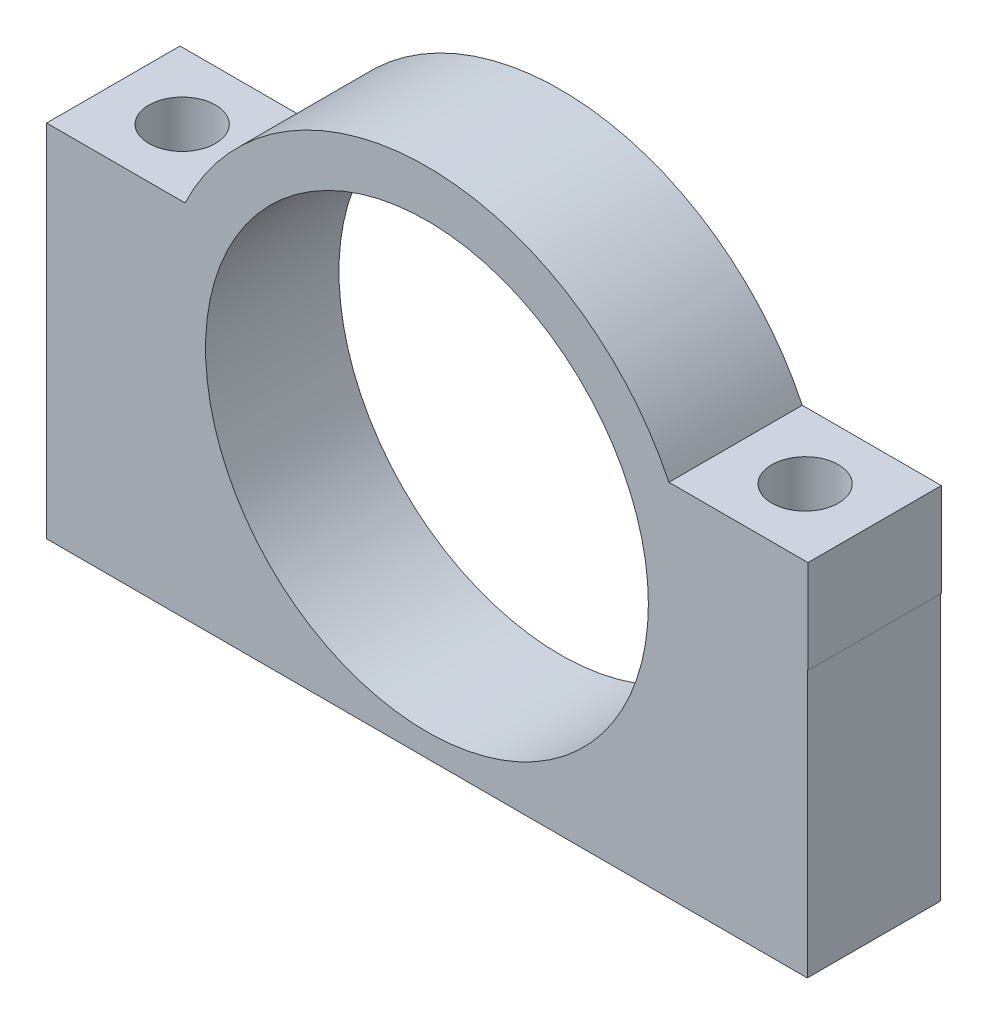
ISO-10303-21;
HEADER;
FILE_DESCRIPTION(('STEP AP214'),'2;1');
FILE_NAME('part.step','',(''),(''),'','','');
FILE_SCHEMA(('AUTOMOTIVE_DESIGN { 1 0 10303 214 1 1 1 1 }'));
ENDSEC;
DATA;
#1=APPLICATION_CONTEXT('core data for automotive mechanical design processes');
#2=APPLICATION_PROTOCOL_DEFINITION('international standard','automotive_design',2000,#1);
#3=PRODUCT_CONTEXT('',#1,'mechanical');
#4=PRODUCT('Part','Part','',(#3));
#5=PRODUCT_RELATED_PRODUCT_CATEGORY('part','',(#4));
#6=PRODUCT_DEFINITION_FORMATION('','',#4);
#7=PRODUCT_DEFINITION_CONTEXT('part definition',#1,'design');
#8=PRODUCT_DEFINITION('design','',#6,#7);
#9=PRODUCT_DEFINITION_SHAPE('','',#8);
#10=(LENGTH_UNIT() NAMED_UNIT(*) SI_UNIT(.MILLI.,.METRE.));
#11=(NAMED_UNIT(*) PLANE_ANGLE_UNIT() SI_UNIT($,.RADIAN.));
#12=(NAMED_UNIT(*) SI_UNIT($,.STERADIAN.) SOLID_ANGLE_UNIT());
#13=UNCERTAINTY_MEASURE_WITH_UNIT(LENGTH_MEASURE(1.E-05),#10,'distance_accuracy_value','');
#14=(GEOMETRIC_REPRESENTATION_CONTEXT(3) GLOBAL_UNCERTAINTY_ASSIGNED_CONTEXT((#13)) GLOBAL_UNIT_ASSIGNED_CONTEXT((#10,
#11,#12)) REPRESENTATION_CONTEXT('',''));
#15=CARTESIAN_POINT('',(0.,0.,0.));
#16=DIRECTION('',(0.,0.,1.));
#17=DIRECTION('',(1.,0.,0.));
#18=AXIS2_PLACEMENT_3D('',#15,#16,#17);
#19=CARTESIAN_POINT('',(36.2143518703444,-23.2722576239167,12.7));
#20=DIRECTION('',(0.,1.,0.));
#21=DIRECTION('',(-1.,0.,0.));
#22=AXIS2_PLACEMENT_3D('',#19,#20,#21);
#23=PLANE('',#22);
#24=CARTESIAN_POINT('',(29.6581243907941,-23.2722576239167,6.35));
#25=DIRECTION('',(0.,1.,0.));
#26=DIRECTION('',(-1.,0.,0.));
#27=AXIS2_PLACEMENT_3D('',#24,#25,#26);
#28=CIRCLE('',#27,3.17500000000001);
#29=CARTESIAN_POINT('',(26.4831243907941,-23.2722576239167,6.35));
#30=VERTEX_POINT('',#29);
#31=EDGE_CURVE('E233',#30,#30,#28,.F.);
#32=ORIENTED_EDGE('',*,*,#31,.F.);
#33=EDGE_LOOP('',(#32));
#34=FACE_BOUND('',#33,.T.);
#35=DIRECTION('',(1.,0.,0.));
#36=VECTOR('',#35,1.);
#37=CARTESIAN_POINT('',(36.2143518703444,-23.2722576239167,0.));
#38=LINE('',#37,#36);
#39=CARTESIAN_POINT('',(-36.2143518703444,-23.2722576239167,0.));
#40=VERTEX_POINT('',#39);
#41=CARTESIAN_POINT('',(36.2143518703444,-23.2722576239167,0.));
#42=VERTEX_POINT('',#41);
#43=EDGE_CURVE('E71',#40,#42,#38,.T.);
#44=ORIENTED_EDGE('',*,*,#43,.T.);
#45=DIRECTION('',(0.,0.,-1.));
#46=VECTOR('',#45,1.);
#47=CARTESIAN_POINT('',(36.2143518703444,-23.2722576239167,12.7));
#48=LINE('',#47,#46);
#49=CARTESIAN_POINT('',(36.2143518703444,-23.2722576239167,12.7));
#50=VERTEX_POINT('',#49);
#51=EDGE_CURVE('E49',#50,#42,#48,.T.);
#52=ORIENTED_EDGE('',*,*,#51,.F.);
#53=DIRECTION('',(1.,0.,0.));
#54=VECTOR('',#53,1.);
#55=CARTESIAN_POINT('',(36.2143518703444,-23.2722576239167,12.7));
#56=LINE('',#55,#54);
#57=CARTESIAN_POINT('',(-36.2143518703444,-23.2722576239167,12.7));
#58=VERTEX_POINT('',#57);
#59=EDGE_CURVE('E183',#58,#50,#56,.T.);
#60=ORIENTED_EDGE('',*,*,#59,.F.);
#61=DIRECTION('',(0.,0.,-1.));
#62=VECTOR('',#61,1.);
#63=CARTESIAN_POINT('',(-36.2143518703444,-23.2722576239167,12.7));
#64=LINE('',#63,#62);
#65=EDGE_CURVE('E11',#58,#40,#64,.T.);
#66=ORIENTED_EDGE('',*,*,#65,.T.);
#67=EDGE_LOOP('',(#44,#52,#60,#66));
#68=FACE_BOUND('',#67,.T.);
#69=CARTESIAN_POINT('',(-29.6581243907941,-23.2722576239167,6.35000000000001));
#70=DIRECTION('',(0.,1.,0.));
#71=DIRECTION('',(-1.,0.,0.));
#72=AXIS2_PLACEMENT_3D('',#69,#70,#71);
#73=CIRCLE('',#72,3.17500000000001);
#74=CARTESIAN_POINT('',(-32.8331243907941,-23.2722576239167,6.35000000000001));
#75=VERTEX_POINT('',#74);
#76=EDGE_CURVE('E152',#75,#75,#73,.T.);
#77=ORIENTED_EDGE('',*,*,#76,.T.);
#78=EDGE_LOOP('',(#77));
#79=FACE_BOUND('',#78,.T.);
#80=ADVANCED_FACE('F39',(#34,#68,#79),#23,.F.);
#81=CARTESIAN_POINT('',(0.,0.,12.7));
#82=DIRECTION('',(0.,0.,-1.));
#83=DIRECTION('',(-1.,0.,0.));
#84=AXIS2_PLACEMENT_3D('',#81,#82,#83);
#85=CYLINDRICAL_SURFACE('',#84,21.082);
#86=CARTESIAN_POINT('',(0.,0.,0.));
#87=DIRECTION('',(0.,0.,-1.));
#88=DIRECTION('',(1.,0.,0.));
#89=AXIS2_PLACEMENT_3D('',#86,#87,#88);
#90=CIRCLE('',#89,21.082);
#91=CARTESIAN_POINT('',(21.082,0.,0.));
#92=VERTEX_POINT('',#91);
#93=EDGE_CURVE('E129',#92,#92,#90,.T.);
#94=ORIENTED_EDGE('',*,*,#93,.T.);
#95=EDGE_LOOP('',(#94));
#96=FACE_BOUND('',#95,.T.);
#97=CARTESIAN_POINT('',(0.,0.,12.7));
#98=DIRECTION('',(0.,0.,-1.));
#99=DIRECTION('',(1.,0.,0.));
#100=AXIS2_PLACEMENT_3D('',#97,#98,#99);
#101=CIRCLE('',#100,21.082);
#102=CARTESIAN_POINT('',(21.082,0.,12.7));
#103=VERTEX_POINT('',#102);
#104=EDGE_CURVE('E177',#103,#103,#101,.T.);
#105=ORIENTED_EDGE('',*,*,#104,.F.);
#106=EDGE_LOOP('',(#105));
#107=FACE_BOUND('',#106,.T.);
#108=ADVANCED_FACE('F41',(#96,#107),#85,.F.);
#109=CARTESIAN_POINT('',(-36.2143518703444,2.12774237608333,12.7));
#110=DIRECTION('',(1.,0.,0.));
#111=DIRECTION('',(0.,1.,0.));
#112=AXIS2_PLACEMENT_3D('',#109,#110,#111);
#113=PLANE('',#112);
#114=DIRECTION('',(0.,-1.,0.));
#115=VECTOR('',#114,1.);
#116=CARTESIAN_POINT('',(-36.2143518703444,2.12774237608333,0.));
#117=LINE('',#116,#115);
#118=CARTESIAN_POINT('',(-36.2143518703444,11.0177423760833,0.));
#119=VERTEX_POINT('',#118);
#120=EDGE_CURVE('E192',#119,#40,#117,.T.);
#121=ORIENTED_EDGE('',*,*,#120,.T.);
#122=ORIENTED_EDGE('',*,*,#65,.F.);
#123=DIRECTION('',(0.,-1.,0.));
#124=VECTOR('',#123,1.);
#125=CARTESIAN_POINT('',(-36.2143518703444,2.12774237608333,12.7));
#126=LINE('',#125,#124);
#127=CARTESIAN_POINT('',(-36.2143518703444,11.0177423760833,12.7));
#128=VERTEX_POINT('',#127);
#129=EDGE_CURVE('E81',#128,#58,#126,.T.);
#130=ORIENTED_EDGE('',*,*,#129,.F.);
#131=DIRECTION('',(0.,0.,-1.));
#132=VECTOR('',#131,1.);
#133=CARTESIAN_POINT('',(-36.2143518703444,11.0177423760833,12.7));
#134=LINE('',#133,#132);
#135=EDGE_CURVE('E148',#128,#119,#134,.T.);
#136=ORIENTED_EDGE('',*,*,#135,.T.);
#137=EDGE_LOOP('',(#121,#122,#130,#136));
#138=FACE_BOUND('',#137,.T.);
#139=ADVANCED_FACE('F220',(#138),#113,.F.);
#140=CARTESIAN_POINT('',(36.2143518703444,2.12774237608335,12.7));
#141=DIRECTION('',(-1.,0.,0.));
#142=DIRECTION('',(0.,-1.,0.));
#143=AXIS2_PLACEMENT_3D('',#140,#141,#142);
#144=PLANE('',#143);
#145=DIRECTION('',(0.,1.,0.));
#146=VECTOR('',#145,1.);
#147=CARTESIAN_POINT('',(36.2143518703444,2.12774237608335,0.));
#148=LINE('',#147,#146);
#149=CARTESIAN_POINT('',(36.2143518703444,2.12774237608335,0.));
#150=VERTEX_POINT('',#149);
#151=EDGE_CURVE('E76',#42,#150,#148,.T.);
#152=ORIENTED_EDGE('',*,*,#151,.T.);
#153=DIRECTION('',(0.,0.,-1.));
#154=VECTOR('',#153,1.);
#155=CARTESIAN_POINT('',(36.2143518703444,2.12774237608335,12.7));
#156=LINE('',#155,#154);
#157=CARTESIAN_POINT('',(36.2143518703444,2.12774237608335,12.7));
#158=VERTEX_POINT('',#157);
#159=EDGE_CURVE('E188',#158,#150,#156,.T.);
#160=ORIENTED_EDGE('',*,*,#159,.F.);
#161=DIRECTION('',(0.,1.,0.));
#162=VECTOR('',#161,1.);
#163=CARTESIAN_POINT('',(36.2143518703444,2.12774237608335,12.7));
#164=LINE('',#163,#162);
#165=EDGE_CURVE('E57',#50,#158,#164,.T.);
#166=ORIENTED_EDGE('',*,*,#165,.F.);
#167=ORIENTED_EDGE('',*,*,#51,.T.);
#168=EDGE_LOOP('',(#152,#160,#166,#167));
#169=FACE_BOUND('',#168,.T.);
#170=ADVANCED_FACE('F201',(#169),#144,.F.);
#171=CARTESIAN_POINT('',(0.,0.,12.7));
#172=DIRECTION('',(0.,0.,1.));
#173=DIRECTION('',(1.,0.,0.));
#174=AXIS2_PLACEMENT_3D('',#171,#172,#173);
#175=PLANE('',#174);
#176=ORIENTED_EDGE('',*,*,#104,.T.);
#177=EDGE_LOOP('',(#176));
#178=FACE_BOUND('',#177,.T.);
#179=ORIENTED_EDGE('',*,*,#165,.T.);
#180=DIRECTION('',(1.,0.,0.));
#181=VECTOR('',#180,1.);
#182=CARTESIAN_POINT('',(20.9743518703444,2.12774237608334,12.7));
#183=LINE('',#182,#181);
#184=CARTESIAN_POINT('',(36.2796301773197,2.12774237608335,12.7));
#185=VERTEX_POINT('',#184);
#186=EDGE_CURVE('E111',#158,#185,#183,.T.);
#187=ORIENTED_EDGE('',*,*,#186,.T.);
#188=DIRECTION('',(0.,1.,0.));
#189=VECTOR('',#188,1.);
#190=CARTESIAN_POINT('',(36.2796301773197,2.12774237608335,12.7));
#191=LINE('',#190,#189);
#192=CARTESIAN_POINT('',(36.2796301773197,11.0177423760833,12.7));
#193=VERTEX_POINT('',#192);
#194=EDGE_CURVE('E115',#185,#193,#191,.T.);
#195=ORIENTED_EDGE('',*,*,#194,.T.);
#196=DIRECTION('',(-1.,0.,0.));
#197=VECTOR('',#196,1.);
#198=CARTESIAN_POINT('',(36.2796301773197,11.0177423760833,12.7));
#199=LINE('',#198,#197);
#200=CARTESIAN_POINT('',(23.0366186042684,11.0177423760833,12.7));
#201=VERTEX_POINT('',#200);
#202=EDGE_CURVE('E136',#193,#201,#199,.T.);
#203=ORIENTED_EDGE('',*,*,#202,.T.);
#204=CARTESIAN_POINT('',(0.,0.,12.7));
#205=DIRECTION('',(0.,0.,1.));
#206=DIRECTION('',(-1.,0.,0.));
#207=AXIS2_PLACEMENT_3D('',#204,#205,#206);
#208=CIRCLE('',#207,25.535787510556);
#209=CARTESIAN_POINT('',(-23.0366186042684,11.0177423760833,12.7));
#210=VERTEX_POINT('',#209);
#211=EDGE_CURVE('E139',#201,#210,#208,.T.);
#212=ORIENTED_EDGE('',*,*,#211,.T.);
#213=DIRECTION('',(-1.,0.,0.));
#214=VECTOR('',#213,1.);
#215=CARTESIAN_POINT('',(-36.2143518703444,11.0177423760833,12.7));
#216=LINE('',#215,#214);
#217=EDGE_CURVE('E145',#210,#128,#216,.T.);
#218=ORIENTED_EDGE('',*,*,#217,.T.);
#219=ORIENTED_EDGE('',*,*,#129,.T.);
#220=ORIENTED_EDGE('',*,*,#59,.T.);
#221=EDGE_LOOP('',(#179,#187,#195,#203,#212,#218,#219,#220));
#222=FACE_BOUND('',#221,.T.);
#223=ADVANCED_FACE('F113',(#178,#222),#175,.T.);
#224=CARTESIAN_POINT('',(0.,0.,0.));
#225=DIRECTION('',(0.,0.,1.));
#226=DIRECTION('',(1.,0.,0.));
#227=AXIS2_PLACEMENT_3D('',#224,#225,#226);
#228=PLANE('',#227);
#229=ORIENTED_EDGE('',*,*,#93,.F.);
#230=EDGE_LOOP('',(#229));
#231=FACE_BOUND('',#230,.T.);
#232=DIRECTION('',(1.,0.,0.));
#233=VECTOR('',#232,1.);
#234=CARTESIAN_POINT('',(20.9743518703444,2.12774237608334,0.));
#235=LINE('',#234,#233);
#236=CARTESIAN_POINT('',(36.2796301773197,2.12774237608335,0.));
#237=VERTEX_POINT('',#236);
#238=EDGE_CURVE('E125',#150,#237,#235,.T.);
#239=ORIENTED_EDGE('',*,*,#238,.F.);
#240=ORIENTED_EDGE('',*,*,#151,.F.);
#241=ORIENTED_EDGE('',*,*,#43,.F.);
#242=ORIENTED_EDGE('',*,*,#120,.F.);
#243=DIRECTION('',(-1.,0.,0.));
#244=VECTOR('',#243,1.);
#245=CARTESIAN_POINT('',(-36.2143518703444,11.0177423760833,0.));
#246=LINE('',#245,#244);
#247=CARTESIAN_POINT('',(-23.0366186042684,11.0177423760833,0.));
#248=VERTEX_POINT('',#247);
#249=EDGE_CURVE('E119',#248,#119,#246,.T.);
#250=ORIENTED_EDGE('',*,*,#249,.F.);
#251=CARTESIAN_POINT('',(0.,0.,0.));
#252=DIRECTION('',(0.,0.,1.));
#253=DIRECTION('',(-1.,0.,0.));
#254=AXIS2_PLACEMENT_3D('',#251,#252,#253);
#255=CIRCLE('',#254,25.535787510556);
#256=CARTESIAN_POINT('',(23.0366186042684,11.0177423760833,0.));
#257=VERTEX_POINT('',#256);
#258=EDGE_CURVE('E158',#257,#248,#255,.T.);
#259=ORIENTED_EDGE('',*,*,#258,.F.);
#260=DIRECTION('',(-1.,0.,0.));
#261=VECTOR('',#260,1.);
#262=CARTESIAN_POINT('',(36.2796301773197,11.0177423760833,0.));
#263=LINE('',#262,#261);
#264=CARTESIAN_POINT('',(36.2796301773197,11.0177423760833,0.));
#265=VERTEX_POINT('',#264);
#266=EDGE_CURVE('E155',#265,#257,#263,.T.);
#267=ORIENTED_EDGE('',*,*,#266,.F.);
#268=DIRECTION('',(0.,1.,0.));
#269=VECTOR('',#268,1.);
#270=CARTESIAN_POINT('',(36.2796301773197,2.12774237608335,0.));
#271=LINE('',#270,#269);
#272=EDGE_CURVE('E151',#237,#265,#271,.T.);
#273=ORIENTED_EDGE('',*,*,#272,.F.);
#274=EDGE_LOOP('',(#239,#240,#241,#242,#250,#259,#267,#273));
#275=FACE_BOUND('',#274,.T.);
#276=ADVANCED_FACE('F204',(#231,#275),#228,.F.);
#277=CARTESIAN_POINT('',(20.9743518703444,2.12774237608334,12.7));
#278=DIRECTION('',(0.,1.,0.));
#279=DIRECTION('',(-1.,0.,0.));
#280=AXIS2_PLACEMENT_3D('',#277,#278,#279);
#281=PLANE('',#280);
#282=ORIENTED_EDGE('',*,*,#186,.F.);
#283=ORIENTED_EDGE('',*,*,#159,.T.);
#284=ORIENTED_EDGE('',*,*,#238,.T.);
#285=DIRECTION('',(0.,0.,-1.));
#286=VECTOR('',#285,1.);
#287=CARTESIAN_POINT('',(36.2796301773197,2.12774237608335,12.7));
#288=LINE('',#287,#286);
#289=EDGE_CURVE('E122',#185,#237,#288,.T.);
#290=ORIENTED_EDGE('',*,*,#289,.F.);
#291=EDGE_LOOP('',(#282,#283,#284,#290));
#292=FACE_BOUND('',#291,.T.);
#293=ADVANCED_FACE('F123',(#292),#281,.F.);
#294=CARTESIAN_POINT('',(36.2796301773197,2.12774237608335,12.7));
#295=DIRECTION('',(-1.,0.,0.));
#296=DIRECTION('',(0.,0.,1.));
#297=AXIS2_PLACEMENT_3D('',#294,#295,#296);
#298=PLANE('',#297);
#299=ORIENTED_EDGE('',*,*,#272,.T.);
#300=DIRECTION('',(0.,0.,-1.));
#301=VECTOR('',#300,1.);
#302=CARTESIAN_POINT('',(36.2796301773197,11.0177423760833,12.7));
#303=LINE('',#302,#301);
#304=EDGE_CURVE('E130',#193,#265,#303,.T.);
#305=ORIENTED_EDGE('',*,*,#304,.F.);
#306=ORIENTED_EDGE('',*,*,#194,.F.);
#307=ORIENTED_EDGE('',*,*,#289,.T.);
#308=EDGE_LOOP('',(#299,#305,#306,#307));
#309=FACE_BOUND('',#308,.T.);
#310=ADVANCED_FACE('F132',(#309),#298,.F.);
#311=CARTESIAN_POINT('',(36.2796301773197,11.0177423760833,12.7));
#312=DIRECTION('',(0.,-1.,0.));
#313=DIRECTION('',(1.,0.,0.));
#314=AXIS2_PLACEMENT_3D('',#311,#312,#313);
#315=PLANE('',#314);
#316=CARTESIAN_POINT('',(29.6581243907941,11.0177423760833,6.35));
#317=DIRECTION('',(0.,1.,0.));
#318=DIRECTION('',(-1.,0.,0.));
#319=AXIS2_PLACEMENT_3D('',#316,#317,#318);
#320=CIRCLE('',#319,3.17500000000001);
#321=CARTESIAN_POINT('',(26.4831243907941,11.0177423760833,6.35));
#322=VERTEX_POINT('',#321);
#323=EDGE_CURVE('E236',#322,#322,#320,.T.);
#324=ORIENTED_EDGE('',*,*,#323,.F.);
#325=EDGE_LOOP('',(#324));
#326=FACE_BOUND('',#325,.T.);
#327=ORIENTED_EDGE('',*,*,#266,.T.);
#328=DIRECTION('',(0.,0.,-1.));
#329=VECTOR('',#328,1.);
#330=CARTESIAN_POINT('',(23.0366186042684,11.0177423760833,12.7));
#331=LINE('',#330,#329);
#332=EDGE_CURVE('E171',#201,#257,#331,.T.);
#333=ORIENTED_EDGE('',*,*,#332,.F.);
#334=ORIENTED_EDGE('',*,*,#202,.F.);
#335=ORIENTED_EDGE('',*,*,#304,.T.);
#336=EDGE_LOOP('',(#327,#333,#334,#335));
#337=FACE_BOUND('',#336,.T.);
#338=ADVANCED_FACE('F208',(#326,#337),#315,.F.);
#339=CARTESIAN_POINT('',(0.,0.,12.7));
#340=DIRECTION('',(0.,0.,-1.));
#341=DIRECTION('',(-1.,0.,0.));
#342=AXIS2_PLACEMENT_3D('',#339,#340,#341);
#343=CYLINDRICAL_SURFACE('',#342,25.535787510556);
#344=ORIENTED_EDGE('',*,*,#258,.T.);
#345=DIRECTION('',(0.,0.,-1.));
#346=VECTOR('',#345,1.);
#347=CARTESIAN_POINT('',(-23.0366186042684,11.0177423760833,12.7));
#348=LINE('',#347,#346);
#349=EDGE_CURVE('E167',#210,#248,#348,.T.);
#350=ORIENTED_EDGE('',*,*,#349,.F.);
#351=ORIENTED_EDGE('',*,*,#211,.F.);
#352=ORIENTED_EDGE('',*,*,#332,.T.);
#353=EDGE_LOOP('',(#344,#350,#351,#352));
#354=FACE_BOUND('',#353,.T.);
#355=ADVANCED_FACE('F215',(#354),#343,.T.);
#356=CARTESIAN_POINT('',(-36.2143518703444,11.0177423760833,12.7));
#357=DIRECTION('',(0.,-1.,0.));
#358=DIRECTION('',(1.,0.,0.));
#359=AXIS2_PLACEMENT_3D('',#356,#357,#358);
#360=PLANE('',#359);
#361=CARTESIAN_POINT('',(-29.6581243907941,11.0177423760833,6.35000000000001));
#362=DIRECTION('',(0.,1.,0.));
#363=DIRECTION('',(-1.,0.,0.));
#364=AXIS2_PLACEMENT_3D('',#361,#362,#363);
#365=CIRCLE('',#364,3.17500000000001);
#366=CARTESIAN_POINT('',(-32.8331243907941,11.0177423760833,6.35000000000001));
#367=VERTEX_POINT('',#366);
#368=EDGE_CURVE('E229',#367,#367,#365,.F.);
#369=ORIENTED_EDGE('',*,*,#368,.T.);
#370=EDGE_LOOP('',(#369));
#371=FACE_BOUND('',#370,.T.);
#372=ORIENTED_EDGE('',*,*,#249,.T.);
#373=ORIENTED_EDGE('',*,*,#135,.F.);
#374=ORIENTED_EDGE('',*,*,#217,.F.);
#375=ORIENTED_EDGE('',*,*,#349,.T.);
#376=EDGE_LOOP('',(#372,#373,#374,#375));
#377=FACE_BOUND('',#376,.T.);
#378=ADVANCED_FACE('F218',(#371,#377),#360,.F.);
#379=CARTESIAN_POINT('',(-29.6581243907941,-32.2525137449858,6.35000000000001));
#380=DIRECTION('',(0.,1.,0.));
#381=DIRECTION('',(-1.,0.,0.));
#382=AXIS2_PLACEMENT_3D('',#379,#380,#381);
#383=CYLINDRICAL_SURFACE('',#382,3.17500000000001);
#384=ORIENTED_EDGE('',*,*,#76,.F.);
#385=EDGE_LOOP('',(#384));
#386=FACE_BOUND('',#385,.T.);
#387=ORIENTED_EDGE('',*,*,#368,.F.);
#388=EDGE_LOOP('',(#387));
#389=FACE_BOUND('',#388,.T.);
#390=ADVANCED_FACE('F246',(#386,#389),#383,.F.);
#391=CARTESIAN_POINT('',(29.6581243907941,-32.2525137449858,6.35));
#392=DIRECTION('',(0.,1.,0.));
#393=DIRECTION('',(-1.,0.,0.));
#394=AXIS2_PLACEMENT_3D('',#391,#392,#393);
#395=CYLINDRICAL_SURFACE('',#394,3.17500000000001);
#396=ORIENTED_EDGE('',*,*,#31,.T.);
#397=EDGE_LOOP('',(#396));
#398=FACE_BOUND('',#397,.T.);
#399=ORIENTED_EDGE('',*,*,#323,.T.);
#400=EDGE_LOOP('',(#399));
#401=FACE_BOUND('',#400,.T.);
#402=ADVANCED_FACE('F243',(#398,#401),#395,.F.);
#403=CLOSED_SHELL('',(#80,#108,#139,#170,#223,#276,#293,#310,#338,#355,#378,#390,#402));
#404=MANIFOLD_SOLID_BREP('B2',#403);
#405=ADVANCED_BREP_SHAPE_REPRESENTATION('',(#18,#404),#14);
#406=SHAPE_DEFINITION_REPRESENTATION(#9,#405);
ENDSEC;
END-ISO-10303-21;
